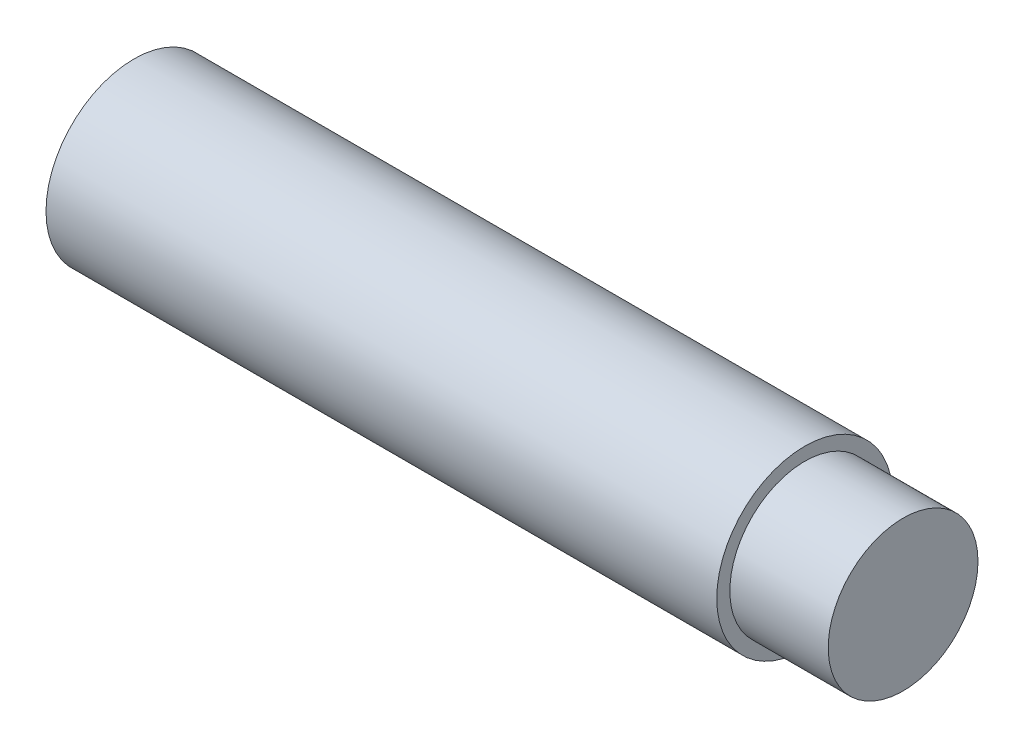
ISO-10303-21;
HEADER;
FILE_DESCRIPTION(('STEP AP214'),'2;1');
FILE_NAME('part.step','',(''),(''),'','','');
FILE_SCHEMA(('AUTOMOTIVE_DESIGN { 1 0 10303 214 1 1 1 1 }'));
ENDSEC;
DATA;
#1=APPLICATION_CONTEXT('core data for automotive mechanical design processes');
#2=APPLICATION_PROTOCOL_DEFINITION('international standard','automotive_design',2000,#1);
#3=PRODUCT_CONTEXT('',#1,'mechanical');
#4=PRODUCT('Part','Part','',(#3));
#5=PRODUCT_RELATED_PRODUCT_CATEGORY('part','',(#4));
#6=PRODUCT_DEFINITION_FORMATION('','',#4);
#7=PRODUCT_DEFINITION_CONTEXT('part definition',#1,'design');
#8=PRODUCT_DEFINITION('design','',#6,#7);
#9=PRODUCT_DEFINITION_SHAPE('','',#8);
#10=(LENGTH_UNIT() NAMED_UNIT(*) SI_UNIT(.MILLI.,.METRE.));
#11=(NAMED_UNIT(*) PLANE_ANGLE_UNIT() SI_UNIT($,.RADIAN.));
#12=(NAMED_UNIT(*) SI_UNIT($,.STERADIAN.) SOLID_ANGLE_UNIT());
#13=UNCERTAINTY_MEASURE_WITH_UNIT(LENGTH_MEASURE(1.E-05),#10,'distance_accuracy_value','');
#14=(GEOMETRIC_REPRESENTATION_CONTEXT(3) GLOBAL_UNCERTAINTY_ASSIGNED_CONTEXT((#13)) GLOBAL_UNIT_ASSIGNED_CONTEXT((#10,
#11,#12)) REPRESENTATION_CONTEXT('',''));
#15=CARTESIAN_POINT('',(0.,0.,0.));
#16=DIRECTION('',(0.,0.,1.));
#17=DIRECTION('',(1.,0.,0.));
#18=AXIS2_PLACEMENT_3D('',#15,#16,#17);
#19=CARTESIAN_POINT('',(30.,0.,0.));
#20=DIRECTION('',(1.,0.,0.));
#21=DIRECTION('',(0.,0.,-1.));
#22=AXIS2_PLACEMENT_3D('',#19,#20,#21);
#23=PLANE('',#22);
#24=CARTESIAN_POINT('',(30.,0.,0.));
#25=DIRECTION('',(1.,0.,0.));
#26=DIRECTION('',(0.,0.,-1.));
#27=AXIS2_PLACEMENT_3D('',#24,#25,#26);
#28=CIRCLE('',#27,3.935);
#29=CARTESIAN_POINT('',(30.,0.,-3.935));
#30=VERTEX_POINT('',#29);
#31=EDGE_CURVE('E10',#30,#30,#28,.T.);
#32=ORIENTED_EDGE('',*,*,#31,.T.);
#33=EDGE_LOOP('',(#32));
#34=FACE_BOUND('',#33,.T.);
#35=CARTESIAN_POINT('',(30.,0.,0.));
#36=DIRECTION('',(1.,0.,0.));
#37=DIRECTION('',(0.,0.,-1.));
#38=AXIS2_PLACEMENT_3D('',#35,#36,#37);
#39=CIRCLE('',#38,3.35);
#40=CARTESIAN_POINT('',(30.,0.,-3.35));
#41=VERTEX_POINT('',#40);
#42=EDGE_CURVE('E47',#41,#41,#39,.T.);
#43=ORIENTED_EDGE('',*,*,#42,.F.);
#44=EDGE_LOOP('',(#43));
#45=FACE_BOUND('',#44,.T.);
#46=ADVANCED_FACE('F34',(#34,#45),#23,.T.);
#47=CARTESIAN_POINT('',(30.,0.,0.));
#48=DIRECTION('',(-1.,0.,0.));
#49=DIRECTION('',(0.,0.,1.));
#50=AXIS2_PLACEMENT_3D('',#47,#48,#49);
#51=CYLINDRICAL_SURFACE('',#50,3.935);
#52=ORIENTED_EDGE('',*,*,#31,.F.);
#53=EDGE_LOOP('',(#52));
#54=FACE_BOUND('',#53,.T.);
#55=CARTESIAN_POINT('',(0.,0.,0.));
#56=DIRECTION('',(1.,0.,0.));
#57=DIRECTION('',(0.,0.,-1.));
#58=AXIS2_PLACEMENT_3D('',#55,#56,#57);
#59=CIRCLE('',#58,3.935);
#60=CARTESIAN_POINT('',(0.,0.,-3.935));
#61=VERTEX_POINT('',#60);
#62=EDGE_CURVE('E38',#61,#61,#59,.T.);
#63=ORIENTED_EDGE('',*,*,#62,.T.);
#64=EDGE_LOOP('',(#63));
#65=FACE_BOUND('',#64,.T.);
#66=ADVANCED_FACE('F36',(#54,#65),#51,.T.);
#67=CARTESIAN_POINT('',(0.,0.,0.));
#68=DIRECTION('',(1.,0.,0.));
#69=DIRECTION('',(0.,0.,-1.));
#70=AXIS2_PLACEMENT_3D('',#67,#68,#69);
#71=PLANE('',#70);
#72=ORIENTED_EDGE('',*,*,#62,.F.);
#73=EDGE_LOOP('',(#72));
#74=FACE_BOUND('',#73,.T.);
#75=ADVANCED_FACE('F58',(#74),#71,.F.);
#76=CARTESIAN_POINT('',(34.4,0.,0.));
#77=DIRECTION('',(-1.,0.,0.));
#78=DIRECTION('',(0.,0.,1.));
#79=AXIS2_PLACEMENT_3D('',#76,#77,#78);
#80=CYLINDRICAL_SURFACE('',#79,3.35);
#81=CARTESIAN_POINT('',(34.4,0.,0.));
#82=DIRECTION('',(1.,0.,0.));
#83=DIRECTION('',(0.,0.,-1.));
#84=AXIS2_PLACEMENT_3D('',#81,#82,#83);
#85=CIRCLE('',#84,3.35);
#86=CARTESIAN_POINT('',(34.4,0.,-3.35));
#87=VERTEX_POINT('',#86);
#88=EDGE_CURVE('E45',#87,#87,#85,.T.);
#89=ORIENTED_EDGE('',*,*,#88,.F.);
#90=EDGE_LOOP('',(#89));
#91=FACE_BOUND('',#90,.T.);
#92=ORIENTED_EDGE('',*,*,#42,.T.);
#93=EDGE_LOOP('',(#92));
#94=FACE_BOUND('',#93,.T.);
#95=ADVANCED_FACE('F55',(#91,#94),#80,.T.);
#96=CARTESIAN_POINT('',(34.4,0.,0.));
#97=DIRECTION('',(1.,0.,0.));
#98=DIRECTION('',(0.,0.,-1.));
#99=AXIS2_PLACEMENT_3D('',#96,#97,#98);
#100=PLANE('',#99);
#101=ORIENTED_EDGE('',*,*,#88,.T.);
#102=EDGE_LOOP('',(#101));
#103=FACE_BOUND('',#102,.T.);
#104=ADVANCED_FACE('F53',(#103),#100,.T.);
#105=CLOSED_SHELL('',(#46,#66,#75,#95,#104));
#106=MANIFOLD_SOLID_BREP('B2',#105);
#107=ADVANCED_BREP_SHAPE_REPRESENTATION('',(#18,#106),#14);
#108=SHAPE_DEFINITION_REPRESENTATION(#9,#107);
ENDSEC;
END-ISO-10303-21;
